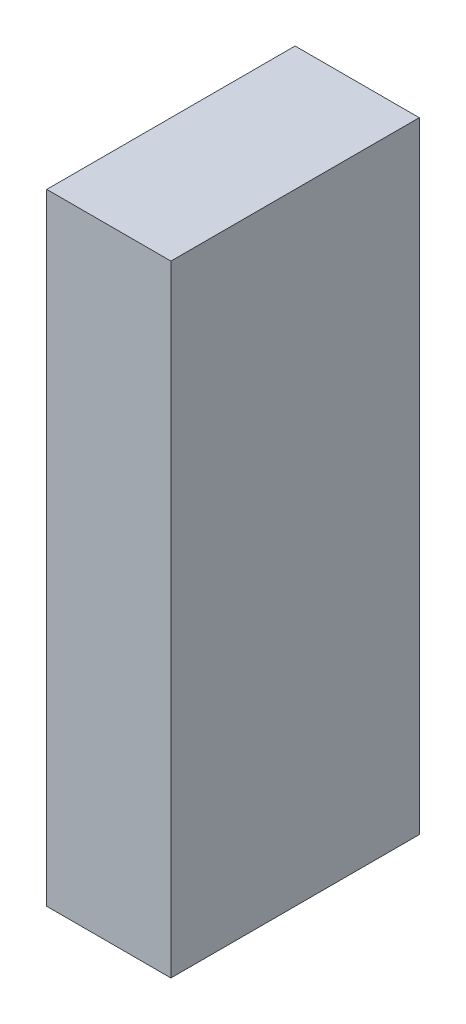
ISO-10303-21;
HEADER;
FILE_DESCRIPTION(('STEP AP214'),'2;1');
FILE_NAME('part.step','',(''),(''),'','','');
FILE_SCHEMA(('AUTOMOTIVE_DESIGN { 1 0 10303 214 1 1 1 1 }'));
ENDSEC;
DATA;
#1=APPLICATION_CONTEXT('core data for automotive mechanical design processes');
#2=APPLICATION_PROTOCOL_DEFINITION('international standard','automotive_design',2000,#1);
#3=PRODUCT_CONTEXT('',#1,'mechanical');
#4=PRODUCT('Part','Part','',(#3));
#5=PRODUCT_RELATED_PRODUCT_CATEGORY('part','',(#4));
#6=PRODUCT_DEFINITION_FORMATION('','',#4);
#7=PRODUCT_DEFINITION_CONTEXT('part definition',#1,'design');
#8=PRODUCT_DEFINITION('design','',#6,#7);
#9=PRODUCT_DEFINITION_SHAPE('','',#8);
#10=(LENGTH_UNIT() NAMED_UNIT(*) SI_UNIT(.MILLI.,.METRE.));
#11=(NAMED_UNIT(*) PLANE_ANGLE_UNIT() SI_UNIT($,.RADIAN.));
#12=(NAMED_UNIT(*) SI_UNIT($,.STERADIAN.) SOLID_ANGLE_UNIT());
#13=UNCERTAINTY_MEASURE_WITH_UNIT(LENGTH_MEASURE(1.E-05),#10,'distance_accuracy_value','');
#14=(GEOMETRIC_REPRESENTATION_CONTEXT(3) GLOBAL_UNCERTAINTY_ASSIGNED_CONTEXT((#13)) GLOBAL_UNIT_ASSIGNED_CONTEXT((#10,
#11,#12)) REPRESENTATION_CONTEXT('',''));
#15=CARTESIAN_POINT('',(0.,0.,0.));
#16=DIRECTION('',(0.,0.,1.));
#17=DIRECTION('',(1.,0.,0.));
#18=AXIS2_PLACEMENT_3D('',#15,#16,#17);
#19=CARTESIAN_POINT('',(0.,0.,40.));
#20=DIRECTION('',(1.,0.,0.));
#21=DIRECTION('',(0.,0.,-1.));
#22=AXIS2_PLACEMENT_3D('',#19,#20,#21);
#23=PLANE('',#22);
#24=DIRECTION('',(0.,-1.,0.));
#25=VECTOR('',#24,1.);
#26=CARTESIAN_POINT('',(0.,0.,0.));
#27=LINE('',#26,#25);
#28=CARTESIAN_POINT('',(0.,100.,0.));
#29=VERTEX_POINT('',#28);
#30=CARTESIAN_POINT('',(0.,0.,0.));
#31=VERTEX_POINT('',#30);
#32=EDGE_CURVE('E104',#29,#31,#27,.T.);
#33=ORIENTED_EDGE('',*,*,#32,.T.);
#34=DIRECTION('',(0.,0.,-1.));
#35=VECTOR('',#34,1.);
#36=CARTESIAN_POINT('',(0.,0.,40.));
#37=LINE('',#36,#35);
#38=CARTESIAN_POINT('',(0.,0.,40.));
#39=VERTEX_POINT('',#38);
#40=EDGE_CURVE('E11',#39,#31,#37,.T.);
#41=ORIENTED_EDGE('',*,*,#40,.F.);
#42=DIRECTION('',(0.,-1.,0.));
#43=VECTOR('',#42,1.);
#44=CARTESIAN_POINT('',(0.,0.,40.));
#45=LINE('',#44,#43);
#46=CARTESIAN_POINT('',(0.,100.,40.));
#47=VERTEX_POINT('',#46);
#48=EDGE_CURVE('E92',#47,#39,#45,.T.);
#49=ORIENTED_EDGE('',*,*,#48,.F.);
#50=DIRECTION('',(0.,0.,-1.));
#51=VECTOR('',#50,1.);
#52=CARTESIAN_POINT('',(0.,100.,40.));
#53=LINE('',#52,#51);
#54=EDGE_CURVE('E100',#47,#29,#53,.T.);
#55=ORIENTED_EDGE('',*,*,#54,.T.);
#56=EDGE_LOOP('',(#33,#41,#49,#55));
#57=FACE_BOUND('',#56,.T.);
#58=ADVANCED_FACE('F41',(#57),#23,.F.);
#59=CARTESIAN_POINT('',(0.,0.,40.));
#60=DIRECTION('',(0.,1.,0.));
#61=DIRECTION('',(0.,0.,1.));
#62=AXIS2_PLACEMENT_3D('',#59,#60,#61);
#63=PLANE('',#62);
#64=DIRECTION('',(1.,0.,0.));
#65=VECTOR('',#64,1.);
#66=CARTESIAN_POINT('',(0.,0.,0.));
#67=LINE('',#66,#65);
#68=CARTESIAN_POINT('',(20.,0.,0.));
#69=VERTEX_POINT('',#68);
#70=EDGE_CURVE('E96',#31,#69,#67,.T.);
#71=ORIENTED_EDGE('',*,*,#70,.T.);
#72=DIRECTION('',(0.,0.,-1.));
#73=VECTOR('',#72,1.);
#74=CARTESIAN_POINT('',(20.,0.,40.));
#75=LINE('',#74,#73);
#76=CARTESIAN_POINT('',(20.,0.,40.));
#77=VERTEX_POINT('',#76);
#78=EDGE_CURVE('E49',#77,#69,#75,.T.);
#79=ORIENTED_EDGE('',*,*,#78,.F.);
#80=DIRECTION('',(1.,0.,0.));
#81=VECTOR('',#80,1.);
#82=CARTESIAN_POINT('',(0.,0.,40.));
#83=LINE('',#82,#81);
#84=EDGE_CURVE('E87',#39,#77,#83,.T.);
#85=ORIENTED_EDGE('',*,*,#84,.F.);
#86=ORIENTED_EDGE('',*,*,#40,.T.);
#87=EDGE_LOOP('',(#71,#79,#85,#86));
#88=FACE_BOUND('',#87,.T.);
#89=ADVANCED_FACE('F95',(#88),#63,.F.);
#90=CARTESIAN_POINT('',(20.,0.,40.));
#91=DIRECTION('',(-1.,0.,0.));
#92=DIRECTION('',(0.,0.,1.));
#93=AXIS2_PLACEMENT_3D('',#90,#91,#92);
#94=PLANE('',#93);
#95=DIRECTION('',(0.,1.,0.));
#96=VECTOR('',#95,1.);
#97=CARTESIAN_POINT('',(20.,0.,0.));
#98=LINE('',#97,#96);
#99=CARTESIAN_POINT('',(20.,100.,0.));
#100=VERTEX_POINT('',#99);
#101=EDGE_CURVE('E74',#69,#100,#98,.T.);
#102=ORIENTED_EDGE('',*,*,#101,.T.);
#103=DIRECTION('',(0.,0.,-1.));
#104=VECTOR('',#103,1.);
#105=CARTESIAN_POINT('',(20.,100.,40.));
#106=LINE('',#105,#104);
#107=CARTESIAN_POINT('',(20.,100.,40.));
#108=VERTEX_POINT('',#107);
#109=EDGE_CURVE('E97',#108,#100,#106,.T.);
#110=ORIENTED_EDGE('',*,*,#109,.F.);
#111=DIRECTION('',(0.,1.,0.));
#112=VECTOR('',#111,1.);
#113=CARTESIAN_POINT('',(20.,0.,40.));
#114=LINE('',#113,#112);
#115=EDGE_CURVE('E90',#77,#108,#114,.T.);
#116=ORIENTED_EDGE('',*,*,#115,.F.);
#117=ORIENTED_EDGE('',*,*,#78,.T.);
#118=EDGE_LOOP('',(#102,#110,#116,#117));
#119=FACE_BOUND('',#118,.T.);
#120=ADVANCED_FACE('F98',(#119),#94,.F.);
#121=CARTESIAN_POINT('',(0.,100.,40.));
#122=DIRECTION('',(0.,-1.,0.));
#123=DIRECTION('',(0.,0.,-1.));
#124=AXIS2_PLACEMENT_3D('',#121,#122,#123);
#125=PLANE('',#124);
#126=DIRECTION('',(-1.,0.,0.));
#127=VECTOR('',#126,1.);
#128=CARTESIAN_POINT('',(0.,100.,0.));
#129=LINE('',#128,#127);
#130=EDGE_CURVE('E80',#100,#29,#129,.T.);
#131=ORIENTED_EDGE('',*,*,#130,.T.);
#132=ORIENTED_EDGE('',*,*,#54,.F.);
#133=DIRECTION('',(-1.,0.,0.));
#134=VECTOR('',#133,1.);
#135=CARTESIAN_POINT('',(0.,100.,40.));
#136=LINE('',#135,#134);
#137=EDGE_CURVE('E57',#108,#47,#136,.T.);
#138=ORIENTED_EDGE('',*,*,#137,.F.);
#139=ORIENTED_EDGE('',*,*,#109,.T.);
#140=EDGE_LOOP('',(#131,#132,#138,#139));
#141=FACE_BOUND('',#140,.T.);
#142=ADVANCED_FACE('F111',(#141),#125,.F.);
#143=CARTESIAN_POINT('',(0.,0.,40.));
#144=DIRECTION('',(0.,0.,-1.));
#145=DIRECTION('',(-1.,0.,0.));
#146=AXIS2_PLACEMENT_3D('',#143,#144,#145);
#147=PLANE('',#146);
#148=ORIENTED_EDGE('',*,*,#48,.T.);
#149=ORIENTED_EDGE('',*,*,#84,.T.);
#150=ORIENTED_EDGE('',*,*,#115,.T.);
#151=ORIENTED_EDGE('',*,*,#137,.T.);
#152=EDGE_LOOP('',(#148,#149,#150,#151));
#153=FACE_BOUND('',#152,.T.);
#154=ADVANCED_FACE('F88',(#153),#147,.F.);
#155=CARTESIAN_POINT('',(0.,0.,0.));
#156=DIRECTION('',(0.,0.,-1.));
#157=DIRECTION('',(-1.,0.,0.));
#158=AXIS2_PLACEMENT_3D('',#155,#156,#157);
#159=PLANE('',#158);
#160=ORIENTED_EDGE('',*,*,#32,.F.);
#161=ORIENTED_EDGE('',*,*,#130,.F.);
#162=ORIENTED_EDGE('',*,*,#101,.F.);
#163=ORIENTED_EDGE('',*,*,#70,.F.);
#164=EDGE_LOOP('',(#160,#161,#162,#163));
#165=FACE_BOUND('',#164,.T.);
#166=ADVANCED_FACE('F114',(#165),#159,.T.);
#167=CLOSED_SHELL('',(#58,#89,#120,#142,#154,#166));
#168=MANIFOLD_SOLID_BREP('B2',#167);
#169=ADVANCED_BREP_SHAPE_REPRESENTATION('',(#18,#168),#14);
#170=SHAPE_DEFINITION_REPRESENTATION(#9,#169);
ENDSEC;
END-ISO-10303-21;
